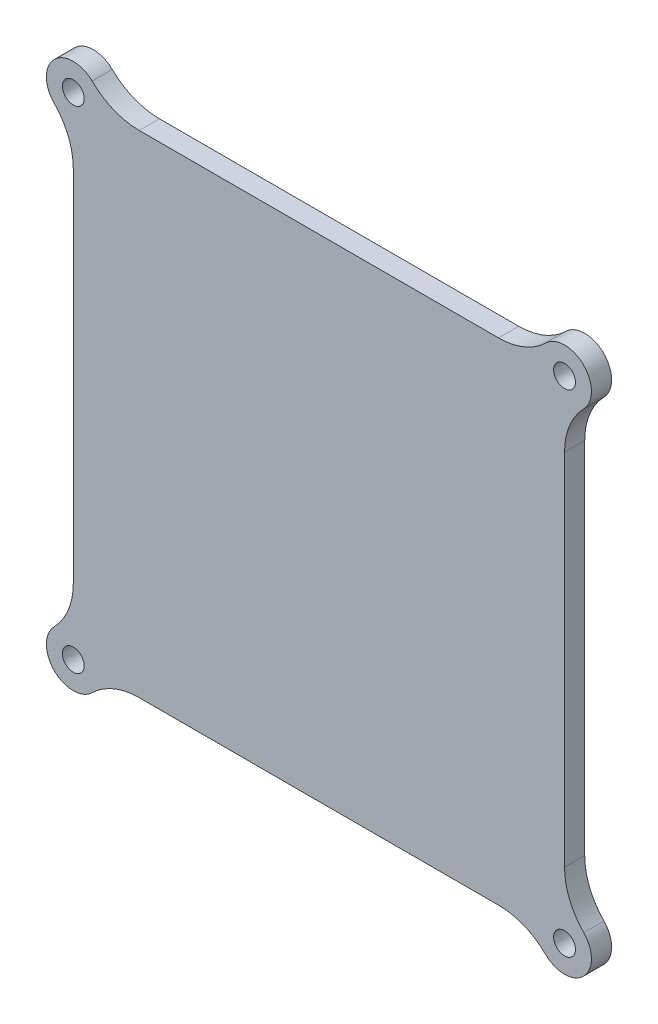
ISO-10303-21;
HEADER;
FILE_DESCRIPTION(('STEP AP214'),'2;1');
FILE_NAME('part.step','',(''),(''),'','','');
FILE_SCHEMA(('AUTOMOTIVE_DESIGN { 1 0 10303 214 1 1 1 1 }'));
ENDSEC;
DATA;
#1=APPLICATION_CONTEXT('core data for automotive mechanical design processes');
#2=APPLICATION_PROTOCOL_DEFINITION('international standard','automotive_design',2000,#1);
#3=PRODUCT_CONTEXT('',#1,'mechanical');
#4=PRODUCT('Part','Part','',(#3));
#5=PRODUCT_RELATED_PRODUCT_CATEGORY('part','',(#4));
#6=PRODUCT_DEFINITION_FORMATION('','',#4);
#7=PRODUCT_DEFINITION_CONTEXT('part definition',#1,'design');
#8=PRODUCT_DEFINITION('design','',#6,#7);
#9=PRODUCT_DEFINITION_SHAPE('','',#8);
#10=(LENGTH_UNIT() NAMED_UNIT(*) SI_UNIT(.MILLI.,.METRE.));
#11=(NAMED_UNIT(*) PLANE_ANGLE_UNIT() SI_UNIT($,.RADIAN.));
#12=(NAMED_UNIT(*) SI_UNIT($,.STERADIAN.) SOLID_ANGLE_UNIT());
#13=UNCERTAINTY_MEASURE_WITH_UNIT(LENGTH_MEASURE(1.E-05),#10,'distance_accuracy_value','');
#14=(GEOMETRIC_REPRESENTATION_CONTEXT(3) GLOBAL_UNCERTAINTY_ASSIGNED_CONTEXT((#13)) GLOBAL_UNIT_ASSIGNED_CONTEXT((#10,
#11,#12)) REPRESENTATION_CONTEXT('',''));
#15=CARTESIAN_POINT('',(0.,0.,0.));
#16=DIRECTION('',(0.,0.,1.));
#17=DIRECTION('',(1.,0.,0.));
#18=AXIS2_PLACEMENT_3D('',#15,#16,#17);
#19=CARTESIAN_POINT('',(-36.5160555535694,-36.5160555535694,3.));
#20=DIRECTION('',(0.,0.,-1.));
#21=DIRECTION('',(-1.,0.,0.));
#22=AXIS2_PLACEMENT_3D('',#19,#20,#21);
#23=CYLINDRICAL_SURFACE('',#22,4.);
#24=CARTESIAN_POINT('',(-36.5160555535694,-36.5160555535694,0.));
#25=DIRECTION('',(0.,0.,1.));
#26=DIRECTION('',(1.,0.,0.));
#27=AXIS2_PLACEMENT_3D('',#24,#25,#26);
#28=CIRCLE('',#27,4.);
#29=CARTESIAN_POINT('',(-39.3731984107122,-33.7166387046743,0.));
#30=VERTEX_POINT('',#29);
#31=CARTESIAN_POINT('',(-33.7166387046743,-39.3731984107122,0.));
#32=VERTEX_POINT('',#31);
#33=EDGE_CURVE('E174',#30,#32,#28,.T.);
#34=ORIENTED_EDGE('',*,*,#33,.T.);
#35=DIRECTION('',(0.,0.,-1.));
#36=VECTOR('',#35,1.);
#37=CARTESIAN_POINT('',(-33.7166387046743,-39.3731984107122,3.));
#38=LINE('',#37,#36);
#39=CARTESIAN_POINT('',(-33.7166387046743,-39.3731984107122,3.));
#40=VERTEX_POINT('',#39);
#41=EDGE_CURVE('E153',#32,#40,#38,.F.);
#42=ORIENTED_EDGE('',*,*,#41,.T.);
#43=CARTESIAN_POINT('',(-36.5160555535694,-36.5160555535694,3.));
#44=DIRECTION('',(0.,0.,1.));
#45=DIRECTION('',(1.,0.,0.));
#46=AXIS2_PLACEMENT_3D('',#43,#44,#45);
#47=CIRCLE('',#46,4.);
#48=CARTESIAN_POINT('',(-39.3731984107122,-33.7166387046743,3.));
#49=VERTEX_POINT('',#48);
#50=EDGE_CURVE('E207',#49,#40,#47,.T.);
#51=ORIENTED_EDGE('',*,*,#50,.F.);
#52=DIRECTION('',(0.,0.,-1.));
#53=VECTOR('',#52,1.);
#54=CARTESIAN_POINT('',(-39.3731984107122,-33.7166387046743,3.));
#55=LINE('',#54,#53);
#56=EDGE_CURVE('E167',#49,#30,#55,.T.);
#57=ORIENTED_EDGE('',*,*,#56,.T.);
#58=EDGE_LOOP('',(#34,#42,#51,#57));
#59=FACE_BOUND('',#58,.T.);
#60=ADVANCED_FACE('F35',(#59),#23,.T.);
#61=CARTESIAN_POINT('',(0.,-36.5160555535694,3.));
#62=DIRECTION('',(0.,1.,0.));
#63=DIRECTION('',(0.,0.,1.));
#64=AXIS2_PLACEMENT_3D('',#61,#62,#63);
#65=PLANE('',#64);
#66=DIRECTION('',(1.,0.,0.));
#67=VECTOR('',#66,1.);
#68=CARTESIAN_POINT('',(0.,-36.5160555535694,3.));
#69=LINE('',#68,#67);
#70=CARTESIAN_POINT('',(-26.7180965824366,-36.5160555535694,3.));
#71=VERTEX_POINT('',#70);
#72=CARTESIAN_POINT('',(26.7180965824361,-36.5160555535694,3.));
#73=VERTEX_POINT('',#72);
#74=EDGE_CURVE('E166',#71,#73,#69,.T.);
#75=ORIENTED_EDGE('',*,*,#74,.F.);
#76=DIRECTION('',(0.,0.,1.));
#77=VECTOR('',#76,1.);
#78=CARTESIAN_POINT('',(-26.7180965824366,-36.5160555535694,0.));
#79=LINE('',#78,#77);
#80=CARTESIAN_POINT('',(-26.7180965824366,-36.5160555535694,0.));
#81=VERTEX_POINT('',#80);
#82=EDGE_CURVE('E152',#71,#81,#79,.F.);
#83=ORIENTED_EDGE('',*,*,#82,.T.);
#84=DIRECTION('',(1.,0.,0.));
#85=VECTOR('',#84,1.);
#86=CARTESIAN_POINT('',(0.,-36.5160555535694,0.));
#87=LINE('',#86,#85);
#88=CARTESIAN_POINT('',(26.7180965824361,-36.5160555535694,0.));
#89=VERTEX_POINT('',#88);
#90=EDGE_CURVE('E164',#81,#89,#87,.T.);
#91=ORIENTED_EDGE('',*,*,#90,.T.);
#92=DIRECTION('',(0.,0.,1.));
#93=VECTOR('',#92,1.);
#94=CARTESIAN_POINT('',(26.7180965824361,-36.5160555535694,3.));
#95=LINE('',#94,#93);
#96=EDGE_CURVE('E168',#89,#73,#95,.T.);
#97=ORIENTED_EDGE('',*,*,#96,.T.);
#98=EDGE_LOOP('',(#75,#83,#91,#97));
#99=FACE_BOUND('',#98,.T.);
#100=ADVANCED_FACE('F163',(#99),#65,.F.);
#101=CARTESIAN_POINT('',(36.5160555535691,-36.5160555535696,3.));
#102=DIRECTION('',(0.,0.,-1.));
#103=DIRECTION('',(-1.,0.,0.));
#104=AXIS2_PLACEMENT_3D('',#101,#102,#103);
#105=CYLINDRICAL_SURFACE('',#104,4.);
#106=CARTESIAN_POINT('',(36.5160555535691,-36.5160555535696,0.));
#107=DIRECTION('',(0.,0.,1.));
#108=DIRECTION('',(1.,0.,0.));
#109=AXIS2_PLACEMENT_3D('',#106,#107,#108);
#110=CIRCLE('',#109,4.);
#111=CARTESIAN_POINT('',(33.716638704674,-39.3731984107124,0.));
#112=VERTEX_POINT('',#111);
#113=CARTESIAN_POINT('',(39.373198410712,-33.7166387046747,0.));
#114=VERTEX_POINT('',#113);
#115=EDGE_CURVE('E173',#112,#114,#110,.T.);
#116=ORIENTED_EDGE('',*,*,#115,.T.);
#117=DIRECTION('',(0.,0.,-1.));
#118=VECTOR('',#117,1.);
#119=CARTESIAN_POINT('',(39.373198410712,-33.7166387046747,3.));
#120=LINE('',#119,#118);
#121=CARTESIAN_POINT('',(39.373198410712,-33.7166387046747,3.));
#122=VERTEX_POINT('',#121);
#123=EDGE_CURVE('E50',#114,#122,#120,.F.);
#124=ORIENTED_EDGE('',*,*,#123,.T.);
#125=CARTESIAN_POINT('',(36.5160555535691,-36.5160555535696,3.));
#126=DIRECTION('',(0.,0.,1.));
#127=DIRECTION('',(1.,0.,0.));
#128=AXIS2_PLACEMENT_3D('',#125,#126,#127);
#129=CIRCLE('',#128,4.);
#130=CARTESIAN_POINT('',(33.716638704674,-39.3731984107124,3.));
#131=VERTEX_POINT('',#130);
#132=EDGE_CURVE('E274',#131,#122,#129,.T.);
#133=ORIENTED_EDGE('',*,*,#132,.F.);
#134=DIRECTION('',(0.,0.,-1.));
#135=VECTOR('',#134,1.);
#136=CARTESIAN_POINT('',(33.716638704674,-39.3731984107124,3.));
#137=LINE('',#136,#135);
#138=EDGE_CURVE('E238',#131,#112,#137,.T.);
#139=ORIENTED_EDGE('',*,*,#138,.T.);
#140=EDGE_LOOP('',(#116,#124,#133,#139));
#141=FACE_BOUND('',#140,.T.);
#142=ADVANCED_FACE('F284',(#141),#105,.T.);
#143=CARTESIAN_POINT('',(36.5160555535694,0.,3.));
#144=DIRECTION('',(-1.,0.,0.));
#145=DIRECTION('',(0.,-1.,0.));
#146=AXIS2_PLACEMENT_3D('',#143,#144,#145);
#147=PLANE('',#146);
#148=DIRECTION('',(0.,1.,0.));
#149=VECTOR('',#148,1.);
#150=CARTESIAN_POINT('',(36.5160555535694,0.,0.));
#151=LINE('',#150,#149);
#152=CARTESIAN_POINT('',(36.5160555535694,-26.7180965824372,0.));
#153=VERTEX_POINT('',#152);
#154=CARTESIAN_POINT('',(36.5160555535695,26.7180965824365,0.));
#155=VERTEX_POINT('',#154);
#156=EDGE_CURVE('E176',#153,#155,#151,.T.);
#157=ORIENTED_EDGE('',*,*,#156,.T.);
#158=DIRECTION('',(0.,0.,1.));
#159=VECTOR('',#158,1.);
#160=CARTESIAN_POINT('',(36.5160555535695,26.7180965824365,3.));
#161=LINE('',#160,#159);
#162=CARTESIAN_POINT('',(36.5160555535695,26.7180965824365,3.));
#163=VERTEX_POINT('',#162);
#164=EDGE_CURVE('E236',#155,#163,#161,.T.);
#165=ORIENTED_EDGE('',*,*,#164,.T.);
#166=DIRECTION('',(0.,1.,0.));
#167=VECTOR('',#166,1.);
#168=CARTESIAN_POINT('',(36.5160555535694,0.,3.));
#169=LINE('',#168,#167);
#170=CARTESIAN_POINT('',(36.5160555535694,-26.7180965824372,3.));
#171=VERTEX_POINT('',#170);
#172=EDGE_CURVE('E272',#171,#163,#169,.T.);
#173=ORIENTED_EDGE('',*,*,#172,.F.);
#174=DIRECTION('',(0.,0.,1.));
#175=VECTOR('',#174,1.);
#176=CARTESIAN_POINT('',(36.5160555535694,-26.7180965824372,0.));
#177=LINE('',#176,#175);
#178=EDGE_CURVE('E233',#171,#153,#177,.F.);
#179=ORIENTED_EDGE('',*,*,#178,.T.);
#180=EDGE_LOOP('',(#157,#165,#173,#179));
#181=FACE_BOUND('',#180,.T.);
#182=ADVANCED_FACE('F278',(#181),#147,.F.);
#183=CARTESIAN_POINT('',(36.5160555535695,36.5160555535692,3.));
#184=DIRECTION('',(0.,0.,-1.));
#185=DIRECTION('',(-1.,0.,0.));
#186=AXIS2_PLACEMENT_3D('',#183,#184,#185);
#187=CYLINDRICAL_SURFACE('',#186,4.);
#188=CARTESIAN_POINT('',(36.5160555535695,36.5160555535692,0.));
#189=DIRECTION('',(0.,0.,1.));
#190=DIRECTION('',(1.,0.,0.));
#191=AXIS2_PLACEMENT_3D('',#188,#189,#190);
#192=CIRCLE('',#191,4.);
#193=CARTESIAN_POINT('',(39.3731984107123,33.7166387046742,0.));
#194=VERTEX_POINT('',#193);
#195=CARTESIAN_POINT('',(33.7166387046744,39.3731984107121,0.));
#196=VERTEX_POINT('',#195);
#197=EDGE_CURVE('E183',#194,#196,#192,.T.);
#198=ORIENTED_EDGE('',*,*,#197,.T.);
#199=DIRECTION('',(0.,0.,-1.));
#200=VECTOR('',#199,1.);
#201=CARTESIAN_POINT('',(33.7166387046744,39.3731984107121,3.));
#202=LINE('',#201,#200);
#203=CARTESIAN_POINT('',(33.7166387046744,39.3731984107121,3.));
#204=VERTEX_POINT('',#203);
#205=EDGE_CURVE('E231',#196,#204,#202,.F.);
#206=ORIENTED_EDGE('',*,*,#205,.T.);
#207=CARTESIAN_POINT('',(36.5160555535695,36.5160555535692,3.));
#208=DIRECTION('',(0.,0.,1.));
#209=DIRECTION('',(1.,0.,0.));
#210=AXIS2_PLACEMENT_3D('',#207,#208,#209);
#211=CIRCLE('',#210,4.);
#212=CARTESIAN_POINT('',(39.3731984107123,33.7166387046742,3.));
#213=VERTEX_POINT('',#212);
#214=EDGE_CURVE('E281',#213,#204,#211,.T.);
#215=ORIENTED_EDGE('',*,*,#214,.F.);
#216=DIRECTION('',(0.,0.,-1.));
#217=VECTOR('',#216,1.);
#218=CARTESIAN_POINT('',(39.3731984107123,33.7166387046742,3.));
#219=LINE('',#218,#217);
#220=EDGE_CURVE('E228',#213,#194,#219,.T.);
#221=ORIENTED_EDGE('',*,*,#220,.T.);
#222=EDGE_LOOP('',(#198,#206,#215,#221));
#223=FACE_BOUND('',#222,.T.);
#224=ADVANCED_FACE('F451',(#223),#187,.T.);
#225=CARTESIAN_POINT('',(0.,36.5160555535693,3.));
#226=DIRECTION('',(0.,1.,0.));
#227=DIRECTION('',(-1.,0.,0.));
#228=AXIS2_PLACEMENT_3D('',#225,#226,#227);
#229=PLANE('',#228);
#230=DIRECTION('',(1.,0.,0.));
#231=VECTOR('',#230,1.);
#232=CARTESIAN_POINT('',(0.,36.5160555535693,0.));
#233=LINE('',#232,#231);
#234=CARTESIAN_POINT('',(-26.7180965824367,36.5160555535694,0.));
#235=VERTEX_POINT('',#234);
#236=CARTESIAN_POINT('',(26.7180965824368,36.5160555535693,0.));
#237=VERTEX_POINT('',#236);
#238=EDGE_CURVE('E186',#235,#237,#233,.T.);
#239=ORIENTED_EDGE('',*,*,#238,.F.);
#240=DIRECTION('',(0.,0.,-1.));
#241=VECTOR('',#240,1.);
#242=CARTESIAN_POINT('',(-26.7180965824367,36.5160555535694,3.));
#243=LINE('',#242,#241);
#244=CARTESIAN_POINT('',(-26.7180965824367,36.5160555535694,3.));
#245=VERTEX_POINT('',#244);
#246=EDGE_CURVE('E226',#235,#245,#243,.F.);
#247=ORIENTED_EDGE('',*,*,#246,.T.);
#248=DIRECTION('',(1.,0.,0.));
#249=VECTOR('',#248,1.);
#250=CARTESIAN_POINT('',(0.,36.5160555535693,3.));
#251=LINE('',#250,#249);
#252=CARTESIAN_POINT('',(26.7180965824368,36.5160555535693,3.));
#253=VERTEX_POINT('',#252);
#254=EDGE_CURVE('E294',#245,#253,#251,.T.);
#255=ORIENTED_EDGE('',*,*,#254,.T.);
#256=DIRECTION('',(0.,0.,-1.));
#257=VECTOR('',#256,1.);
#258=CARTESIAN_POINT('',(26.7180965824368,36.5160555535693,3.));
#259=LINE('',#258,#257);
#260=EDGE_CURVE('E223',#253,#237,#259,.T.);
#261=ORIENTED_EDGE('',*,*,#260,.T.);
#262=EDGE_LOOP('',(#239,#247,#255,#261));
#263=FACE_BOUND('',#262,.T.);
#264=ADVANCED_FACE('F439',(#263),#229,.T.);
#265=CARTESIAN_POINT('',(-36.5160555535694,36.5160555535694,3.));
#266=DIRECTION('',(0.,0.,-1.));
#267=DIRECTION('',(-1.,0.,0.));
#268=AXIS2_PLACEMENT_3D('',#265,#266,#267);
#269=CYLINDRICAL_SURFACE('',#268,4.);
#270=CARTESIAN_POINT('',(-36.5160555535694,36.5160555535694,3.));
#271=DIRECTION('',(0.,0.,1.));
#272=DIRECTION('',(1.,0.,0.));
#273=AXIS2_PLACEMENT_3D('',#270,#271,#272);
#274=CIRCLE('',#273,4.);
#275=CARTESIAN_POINT('',(-33.7166387046743,39.3731984107122,3.));
#276=VERTEX_POINT('',#275);
#277=CARTESIAN_POINT('',(-39.3731984107122,33.7166387046743,3.));
#278=VERTEX_POINT('',#277);
#279=EDGE_CURVE('E297',#276,#278,#274,.T.);
#280=ORIENTED_EDGE('',*,*,#279,.F.);
#281=DIRECTION('',(0.,0.,-1.));
#282=VECTOR('',#281,1.);
#283=CARTESIAN_POINT('',(-33.7166387046743,39.3731984107122,3.));
#284=LINE('',#283,#282);
#285=CARTESIAN_POINT('',(-33.7166387046743,39.3731984107122,0.));
#286=VERTEX_POINT('',#285);
#287=EDGE_CURVE('E220',#276,#286,#284,.T.);
#288=ORIENTED_EDGE('',*,*,#287,.T.);
#289=CARTESIAN_POINT('',(-36.5160555535694,36.5160555535694,0.));
#290=DIRECTION('',(0.,0.,1.));
#291=DIRECTION('',(1.,0.,0.));
#292=AXIS2_PLACEMENT_3D('',#289,#290,#291);
#293=CIRCLE('',#292,4.);
#294=CARTESIAN_POINT('',(-39.3731984107122,33.7166387046743,0.));
#295=VERTEX_POINT('',#294);
#296=EDGE_CURVE('E189',#286,#295,#293,.T.);
#297=ORIENTED_EDGE('',*,*,#296,.T.);
#298=DIRECTION('',(0.,0.,-1.));
#299=VECTOR('',#298,1.);
#300=CARTESIAN_POINT('',(-39.3731984107122,33.7166387046743,3.));
#301=LINE('',#300,#299);
#302=EDGE_CURVE('E218',#295,#278,#301,.F.);
#303=ORIENTED_EDGE('',*,*,#302,.T.);
#304=EDGE_LOOP('',(#280,#288,#297,#303));
#305=FACE_BOUND('',#304,.T.);
#306=ADVANCED_FACE('F433',(#305),#269,.T.);
#307=CARTESIAN_POINT('',(-36.5160555535694,-36.5160555535694,3.));
#308=DIRECTION('',(0.,0.,-1.));
#309=DIRECTION('',(-1.,0.,0.));
#310=AXIS2_PLACEMENT_3D('',#307,#308,#309);
#311=CYLINDRICAL_SURFACE('',#310,1.6250000000005);
#312=CARTESIAN_POINT('',(-36.5160555535694,-36.5160555535694,3.));
#313=DIRECTION('',(0.,0.,1.));
#314=DIRECTION('',(1.,0.,0.));
#315=AXIS2_PLACEMENT_3D('',#312,#313,#314);
#316=CIRCLE('',#315,1.6250000000005);
#317=CARTESIAN_POINT('',(-34.8910555535689,-36.5160555535694,3.));
#318=VERTEX_POINT('',#317);
#319=EDGE_CURVE('E309',#318,#318,#316,.T.);
#320=ORIENTED_EDGE('',*,*,#319,.T.);
#321=EDGE_LOOP('',(#320));
#322=FACE_BOUND('',#321,.T.);
#323=CARTESIAN_POINT('',(-36.5160555535694,-36.5160555535694,0.));
#324=DIRECTION('',(0.,0.,1.));
#325=DIRECTION('',(1.,0.,0.));
#326=AXIS2_PLACEMENT_3D('',#323,#324,#325);
#327=CIRCLE('',#326,1.6250000000005);
#328=CARTESIAN_POINT('',(-34.8910555535689,-36.5160555535694,0.));
#329=VERTEX_POINT('',#328);
#330=EDGE_CURVE('E201',#329,#329,#327,.T.);
#331=ORIENTED_EDGE('',*,*,#330,.F.);
#332=EDGE_LOOP('',(#331));
#333=FACE_BOUND('',#332,.T.);
#334=ADVANCED_FACE('F438',(#322,#333),#311,.F.);
#335=CARTESIAN_POINT('',(36.5160555535695,36.5160555535692,3.));
#336=DIRECTION('',(0.,0.,-1.));
#337=DIRECTION('',(-1.,0.,0.));
#338=AXIS2_PLACEMENT_3D('',#335,#336,#337);
#339=CYLINDRICAL_SURFACE('',#338,1.62500000000001);
#340=CARTESIAN_POINT('',(36.5160555535695,36.5160555535692,3.));
#341=DIRECTION('',(0.,0.,1.));
#342=DIRECTION('',(1.,0.,0.));
#343=AXIS2_PLACEMENT_3D('',#340,#341,#342);
#344=CIRCLE('',#343,1.62500000000001);
#345=CARTESIAN_POINT('',(38.1410555535695,36.5160555535692,3.));
#346=VERTEX_POINT('',#345);
#347=EDGE_CURVE('E306',#346,#346,#344,.T.);
#348=ORIENTED_EDGE('',*,*,#347,.T.);
#349=EDGE_LOOP('',(#348));
#350=FACE_BOUND('',#349,.T.);
#351=CARTESIAN_POINT('',(36.5160555535695,36.5160555535692,0.));
#352=DIRECTION('',(0.,0.,1.));
#353=DIRECTION('',(1.,0.,0.));
#354=AXIS2_PLACEMENT_3D('',#351,#352,#353);
#355=CIRCLE('',#354,1.62500000000001);
#356=CARTESIAN_POINT('',(38.1410555535695,36.5160555535692,0.));
#357=VERTEX_POINT('',#356);
#358=EDGE_CURVE('E198',#357,#357,#355,.T.);
#359=ORIENTED_EDGE('',*,*,#358,.F.);
#360=EDGE_LOOP('',(#359));
#361=FACE_BOUND('',#360,.T.);
#362=ADVANCED_FACE('F499',(#350,#361),#339,.F.);
#363=CARTESIAN_POINT('',(36.5160555535691,-36.5160555535696,3.));
#364=DIRECTION('',(0.,0.,-1.));
#365=DIRECTION('',(-1.,0.,0.));
#366=AXIS2_PLACEMENT_3D('',#363,#364,#365);
#367=CYLINDRICAL_SURFACE('',#366,1.625);
#368=CARTESIAN_POINT('',(36.5160555535691,-36.5160555535696,3.));
#369=DIRECTION('',(0.,0.,1.));
#370=DIRECTION('',(1.,0.,0.));
#371=AXIS2_PLACEMENT_3D('',#368,#369,#370);
#372=CIRCLE('',#371,1.625);
#373=CARTESIAN_POINT('',(38.1410555535691,-36.5160555535696,3.));
#374=VERTEX_POINT('',#373);
#375=EDGE_CURVE('E303',#374,#374,#372,.T.);
#376=ORIENTED_EDGE('',*,*,#375,.T.);
#377=EDGE_LOOP('',(#376));
#378=FACE_BOUND('',#377,.T.);
#379=CARTESIAN_POINT('',(36.5160555535691,-36.5160555535696,0.));
#380=DIRECTION('',(0.,0.,1.));
#381=DIRECTION('',(1.,0.,0.));
#382=AXIS2_PLACEMENT_3D('',#379,#380,#381);
#383=CIRCLE('',#382,1.625);
#384=CARTESIAN_POINT('',(38.1410555535691,-36.5160555535696,0.));
#385=VERTEX_POINT('',#384);
#386=EDGE_CURVE('E195',#385,#385,#383,.T.);
#387=ORIENTED_EDGE('',*,*,#386,.F.);
#388=EDGE_LOOP('',(#387));
#389=FACE_BOUND('',#388,.T.);
#390=ADVANCED_FACE('F424',(#378,#389),#367,.F.);
#391=CARTESIAN_POINT('',(-36.5160555535694,0.,3.));
#392=DIRECTION('',(-1.,0.,0.));
#393=DIRECTION('',(0.,0.,1.));
#394=AXIS2_PLACEMENT_3D('',#391,#392,#393);
#395=PLANE('',#394);
#396=DIRECTION('',(0.,1.,0.));
#397=VECTOR('',#396,1.);
#398=CARTESIAN_POINT('',(-36.5160555535694,0.,0.));
#399=LINE('',#398,#397);
#400=CARTESIAN_POINT('',(-36.5160555535694,-26.7180965824367,0.));
#401=VERTEX_POINT('',#400);
#402=CARTESIAN_POINT('',(-36.5160555535694,26.7180965824366,0.));
#403=VERTEX_POINT('',#402);
#404=EDGE_CURVE('E192',#401,#403,#399,.T.);
#405=ORIENTED_EDGE('',*,*,#404,.F.);
#406=DIRECTION('',(0.,0.,-1.));
#407=VECTOR('',#406,1.);
#408=CARTESIAN_POINT('',(-36.5160555535694,-26.7180965824367,3.));
#409=LINE('',#408,#407);
#410=CARTESIAN_POINT('',(-36.5160555535694,-26.7180965824367,3.));
#411=VERTEX_POINT('',#410);
#412=EDGE_CURVE('E216',#401,#411,#409,.F.);
#413=ORIENTED_EDGE('',*,*,#412,.T.);
#414=DIRECTION('',(0.,1.,0.));
#415=VECTOR('',#414,1.);
#416=CARTESIAN_POINT('',(-36.5160555535694,0.,3.));
#417=LINE('',#416,#415);
#418=CARTESIAN_POINT('',(-36.5160555535694,26.7180965824366,3.));
#419=VERTEX_POINT('',#418);
#420=EDGE_CURVE('E300',#411,#419,#417,.T.);
#421=ORIENTED_EDGE('',*,*,#420,.T.);
#422=DIRECTION('',(0.,0.,-1.));
#423=VECTOR('',#422,1.);
#424=CARTESIAN_POINT('',(-36.5160555535694,26.7180965824366,3.));
#425=LINE('',#424,#423);
#426=EDGE_CURVE('E213',#419,#403,#425,.T.);
#427=ORIENTED_EDGE('',*,*,#426,.T.);
#428=EDGE_LOOP('',(#405,#413,#421,#427));
#429=FACE_BOUND('',#428,.T.);
#430=ADVANCED_FACE('F324',(#429),#395,.T.);
#431=CARTESIAN_POINT('',(-36.5160555535694,36.5160555535694,3.));
#432=DIRECTION('',(0.,0.,-1.));
#433=DIRECTION('',(-1.,0.,0.));
#434=AXIS2_PLACEMENT_3D('',#431,#432,#433);
#435=CYLINDRICAL_SURFACE('',#434,1.625);
#436=CARTESIAN_POINT('',(-36.5160555535694,36.5160555535694,3.));
#437=DIRECTION('',(0.,0.,1.));
#438=DIRECTION('',(1.,0.,0.));
#439=AXIS2_PLACEMENT_3D('',#436,#437,#438);
#440=CIRCLE('',#439,1.625);
#441=CARTESIAN_POINT('',(-34.8910555535694,36.5160555535694,3.));
#442=VERTEX_POINT('',#441);
#443=EDGE_CURVE('E208',#442,#442,#440,.T.);
#444=ORIENTED_EDGE('',*,*,#443,.T.);
#445=EDGE_LOOP('',(#444));
#446=FACE_BOUND('',#445,.T.);
#447=CARTESIAN_POINT('',(-36.5160555535694,36.5160555535694,0.));
#448=DIRECTION('',(0.,0.,1.));
#449=DIRECTION('',(1.,0.,0.));
#450=AXIS2_PLACEMENT_3D('',#447,#448,#449);
#451=CIRCLE('',#450,1.625);
#452=CARTESIAN_POINT('',(-34.8910555535694,36.5160555535694,0.));
#453=VERTEX_POINT('',#452);
#454=EDGE_CURVE('E204',#453,#453,#451,.T.);
#455=ORIENTED_EDGE('',*,*,#454,.F.);
#456=EDGE_LOOP('',(#455));
#457=FACE_BOUND('',#456,.T.);
#458=ADVANCED_FACE('F314',(#446,#457),#435,.F.);
#459=CARTESIAN_POINT('',(0.,0.,3.));
#460=DIRECTION('',(0.,0.,1.));
#461=DIRECTION('',(1.,0.,0.));
#462=AXIS2_PLACEMENT_3D('',#459,#460,#461);
#463=PLANE('',#462);
#464=ORIENTED_EDGE('',*,*,#420,.F.);
#465=CARTESIAN_POINT('',(-46.5160555535694,-26.7180965824367,3.));
#466=DIRECTION('',(0.,0.,1.));
#467=DIRECTION('',(1.,0.,0.));
#468=AXIS2_PLACEMENT_3D('',#465,#466,#467);
#469=CIRCLE('',#468,10.);
#470=EDGE_CURVE('E245',#411,#49,#469,.F.);
#471=ORIENTED_EDGE('',*,*,#470,.T.);
#472=ORIENTED_EDGE('',*,*,#50,.T.);
#473=CARTESIAN_POINT('',(-26.7180965824366,-46.5160555535694,3.));
#474=DIRECTION('',(0.,0.,1.));
#475=DIRECTION('',(1.,0.,0.));
#476=AXIS2_PLACEMENT_3D('',#473,#474,#475);
#477=CIRCLE('',#476,10.);
#478=EDGE_CURVE('E158',#40,#71,#477,.F.);
#479=ORIENTED_EDGE('',*,*,#478,.T.);
#480=ORIENTED_EDGE('',*,*,#74,.T.);
#481=CARTESIAN_POINT('',(26.7180965824361,-46.5160555535694,3.));
#482=DIRECTION('',(0.,0.,1.));
#483=DIRECTION('',(1.,0.,0.));
#484=AXIS2_PLACEMENT_3D('',#481,#482,#483);
#485=CIRCLE('',#484,10.);
#486=EDGE_CURVE('E11',#73,#131,#485,.F.);
#487=ORIENTED_EDGE('',*,*,#486,.T.);
#488=ORIENTED_EDGE('',*,*,#132,.T.);
#489=CARTESIAN_POINT('',(46.5160555535694,-26.7180965824372,3.));
#490=DIRECTION('',(0.,0.,1.));
#491=DIRECTION('',(1.,0.,0.));
#492=AXIS2_PLACEMENT_3D('',#489,#490,#491);
#493=CIRCLE('',#492,10.);
#494=EDGE_CURVE('E265',#122,#171,#493,.F.);
#495=ORIENTED_EDGE('',*,*,#494,.T.);
#496=ORIENTED_EDGE('',*,*,#172,.T.);
#497=CARTESIAN_POINT('',(46.5160555535695,26.7180965824365,3.));
#498=DIRECTION('',(0.,0.,1.));
#499=DIRECTION('',(1.,0.,0.));
#500=AXIS2_PLACEMENT_3D('',#497,#498,#499);
#501=CIRCLE('',#500,10.);
#502=EDGE_CURVE('E261',#163,#213,#501,.F.);
#503=ORIENTED_EDGE('',*,*,#502,.T.);
#504=ORIENTED_EDGE('',*,*,#214,.T.);
#505=CARTESIAN_POINT('',(26.7180965824368,46.5160555535693,3.));
#506=DIRECTION('',(0.,0.,1.));
#507=DIRECTION('',(1.,0.,0.));
#508=AXIS2_PLACEMENT_3D('',#505,#506,#507);
#509=CIRCLE('',#508,10.);
#510=EDGE_CURVE('E257',#204,#253,#509,.F.);
#511=ORIENTED_EDGE('',*,*,#510,.T.);
#512=ORIENTED_EDGE('',*,*,#254,.F.);
#513=CARTESIAN_POINT('',(-26.7180965824366,46.5160555535694,3.));
#514=DIRECTION('',(0.,0.,1.));
#515=DIRECTION('',(1.,0.,0.));
#516=AXIS2_PLACEMENT_3D('',#513,#514,#515);
#517=CIRCLE('',#516,10.);
#518=EDGE_CURVE('E249',#245,#276,#517,.F.);
#519=ORIENTED_EDGE('',*,*,#518,.T.);
#520=ORIENTED_EDGE('',*,*,#279,.T.);
#521=CARTESIAN_POINT('',(-46.5160555535694,26.7180965824366,3.));
#522=DIRECTION('',(0.,0.,1.));
#523=DIRECTION('',(1.,0.,0.));
#524=AXIS2_PLACEMENT_3D('',#521,#522,#523);
#525=CIRCLE('',#524,10.);
#526=EDGE_CURVE('E253',#278,#419,#525,.F.);
#527=ORIENTED_EDGE('',*,*,#526,.T.);
#528=EDGE_LOOP('',(#464,#471,#472,#479,#480,#487,#488,#495,#496,#503,#504,#511,#512,#519,#520,#527));
#529=FACE_BOUND('',#528,.T.);
#530=ORIENTED_EDGE('',*,*,#375,.F.);
#531=EDGE_LOOP('',(#530));
#532=FACE_BOUND('',#531,.T.);
#533=ORIENTED_EDGE('',*,*,#347,.F.);
#534=EDGE_LOOP('',(#533));
#535=FACE_BOUND('',#534,.T.);
#536=ORIENTED_EDGE('',*,*,#319,.F.);
#537=EDGE_LOOP('',(#536));
#538=FACE_BOUND('',#537,.T.);
#539=ORIENTED_EDGE('',*,*,#443,.F.);
#540=EDGE_LOOP('',(#539));
#541=FACE_BOUND('',#540,.T.);
#542=ADVANCED_FACE('F270',(#529,#532,#535,#538,#541),#463,.T.);
#543=CARTESIAN_POINT('',(0.,0.,0.));
#544=DIRECTION('',(0.,0.,1.));
#545=DIRECTION('',(1.,0.,0.));
#546=AXIS2_PLACEMENT_3D('',#543,#544,#545);
#547=PLANE('',#546);
#548=ORIENTED_EDGE('',*,*,#33,.F.);
#549=CARTESIAN_POINT('',(-46.5160555535694,-26.7180965824367,0.));
#550=DIRECTION('',(0.,0.,1.));
#551=DIRECTION('',(1.,0.,0.));
#552=AXIS2_PLACEMENT_3D('',#549,#550,#551);
#553=CIRCLE('',#552,10.);
#554=EDGE_CURVE('E243',#30,#401,#553,.T.);
#555=ORIENTED_EDGE('',*,*,#554,.T.);
#556=ORIENTED_EDGE('',*,*,#404,.T.);
#557=CARTESIAN_POINT('',(-46.5160555535694,26.7180965824366,0.));
#558=DIRECTION('',(0.,0.,1.));
#559=DIRECTION('',(1.,0.,0.));
#560=AXIS2_PLACEMENT_3D('',#557,#558,#559);
#561=CIRCLE('',#560,10.);
#562=EDGE_CURVE('E251',#403,#295,#561,.T.);
#563=ORIENTED_EDGE('',*,*,#562,.T.);
#564=ORIENTED_EDGE('',*,*,#296,.F.);
#565=CARTESIAN_POINT('',(-26.7180965824366,46.5160555535694,0.));
#566=DIRECTION('',(0.,0.,1.));
#567=DIRECTION('',(1.,0.,0.));
#568=AXIS2_PLACEMENT_3D('',#565,#566,#567);
#569=CIRCLE('',#568,10.);
#570=EDGE_CURVE('E247',#286,#235,#569,.T.);
#571=ORIENTED_EDGE('',*,*,#570,.T.);
#572=ORIENTED_EDGE('',*,*,#238,.T.);
#573=CARTESIAN_POINT('',(26.7180965824368,46.5160555535693,0.));
#574=DIRECTION('',(0.,0.,1.));
#575=DIRECTION('',(1.,0.,0.));
#576=AXIS2_PLACEMENT_3D('',#573,#574,#575);
#577=CIRCLE('',#576,10.);
#578=EDGE_CURVE('E255',#237,#196,#577,.T.);
#579=ORIENTED_EDGE('',*,*,#578,.T.);
#580=ORIENTED_EDGE('',*,*,#197,.F.);
#581=CARTESIAN_POINT('',(46.5160555535695,26.7180965824365,0.));
#582=DIRECTION('',(0.,0.,1.));
#583=DIRECTION('',(1.,0.,0.));
#584=AXIS2_PLACEMENT_3D('',#581,#582,#583);
#585=CIRCLE('',#584,10.);
#586=EDGE_CURVE('E259',#194,#155,#585,.T.);
#587=ORIENTED_EDGE('',*,*,#586,.T.);
#588=ORIENTED_EDGE('',*,*,#156,.F.);
#589=CARTESIAN_POINT('',(46.5160555535694,-26.7180965824372,0.));
#590=DIRECTION('',(0.,0.,1.));
#591=DIRECTION('',(1.,0.,0.));
#592=AXIS2_PLACEMENT_3D('',#589,#590,#591);
#593=CIRCLE('',#592,10.);
#594=EDGE_CURVE('E263',#153,#114,#593,.T.);
#595=ORIENTED_EDGE('',*,*,#594,.T.);
#596=ORIENTED_EDGE('',*,*,#115,.F.);
#597=CARTESIAN_POINT('',(26.7180965824361,-46.5160555535694,0.));
#598=DIRECTION('',(0.,0.,1.));
#599=DIRECTION('',(1.,0.,0.));
#600=AXIS2_PLACEMENT_3D('',#597,#598,#599);
#601=CIRCLE('',#600,10.);
#602=EDGE_CURVE('E43',#112,#89,#601,.T.);
#603=ORIENTED_EDGE('',*,*,#602,.T.);
#604=ORIENTED_EDGE('',*,*,#90,.F.);
#605=CARTESIAN_POINT('',(-26.7180965824366,-46.5160555535694,0.));
#606=DIRECTION('',(0.,0.,1.));
#607=DIRECTION('',(1.,0.,0.));
#608=AXIS2_PLACEMENT_3D('',#605,#606,#607);
#609=CIRCLE('',#608,10.);
#610=EDGE_CURVE('E148',#81,#32,#609,.T.);
#611=ORIENTED_EDGE('',*,*,#610,.T.);
#612=EDGE_LOOP('',(#548,#555,#556,#563,#564,#571,#572,#579,#580,#587,#588,#595,#596,#603,#604,#611));
#613=FACE_BOUND('',#612,.T.);
#614=ORIENTED_EDGE('',*,*,#386,.T.);
#615=EDGE_LOOP('',(#614));
#616=FACE_BOUND('',#615,.T.);
#617=ORIENTED_EDGE('',*,*,#358,.T.);
#618=EDGE_LOOP('',(#617));
#619=FACE_BOUND('',#618,.T.);
#620=ORIENTED_EDGE('',*,*,#330,.T.);
#621=EDGE_LOOP('',(#620));
#622=FACE_BOUND('',#621,.T.);
#623=ORIENTED_EDGE('',*,*,#454,.T.);
#624=EDGE_LOOP('',(#623));
#625=FACE_BOUND('',#624,.T.);
#626=ADVANCED_FACE('F170',(#613,#616,#619,#622,#625),#547,.F.);
#627=CARTESIAN_POINT('',(-26.7180965824366,-46.5160555535694,3.));
#628=DIRECTION('',(0.,0.,-1.));
#629=DIRECTION('',(-1.,0.,0.));
#630=AXIS2_PLACEMENT_3D('',#627,#628,#629);
#631=CYLINDRICAL_SURFACE('',#630,10.);
#632=ORIENTED_EDGE('',*,*,#478,.F.);
#633=ORIENTED_EDGE('',*,*,#41,.F.);
#634=ORIENTED_EDGE('',*,*,#610,.F.);
#635=ORIENTED_EDGE('',*,*,#82,.F.);
#636=EDGE_LOOP('',(#632,#633,#634,#635));
#637=FACE_BOUND('',#636,.T.);
#638=ADVANCED_FACE('F151',(#637),#631,.F.);
#639=CARTESIAN_POINT('',(-46.5160555535694,-26.7180965824367,3.));
#640=DIRECTION('',(0.,0.,-1.));
#641=DIRECTION('',(-1.,0.,0.));
#642=AXIS2_PLACEMENT_3D('',#639,#640,#641);
#643=CYLINDRICAL_SURFACE('',#642,10.);
#644=ORIENTED_EDGE('',*,*,#470,.F.);
#645=ORIENTED_EDGE('',*,*,#412,.F.);
#646=ORIENTED_EDGE('',*,*,#554,.F.);
#647=ORIENTED_EDGE('',*,*,#56,.F.);
#648=EDGE_LOOP('',(#644,#645,#646,#647));
#649=FACE_BOUND('',#648,.T.);
#650=ADVANCED_FACE('F337',(#649),#643,.F.);
#651=CARTESIAN_POINT('',(-26.7180965824366,46.5160555535694,3.));
#652=DIRECTION('',(0.,0.,-1.));
#653=DIRECTION('',(-1.,0.,0.));
#654=AXIS2_PLACEMENT_3D('',#651,#652,#653);
#655=CYLINDRICAL_SURFACE('',#654,10.);
#656=ORIENTED_EDGE('',*,*,#518,.F.);
#657=ORIENTED_EDGE('',*,*,#246,.F.);
#658=ORIENTED_EDGE('',*,*,#570,.F.);
#659=ORIENTED_EDGE('',*,*,#287,.F.);
#660=EDGE_LOOP('',(#656,#657,#658,#659));
#661=FACE_BOUND('',#660,.T.);
#662=ADVANCED_FACE('F340',(#661),#655,.F.);
#663=CARTESIAN_POINT('',(-46.5160555535694,26.7180965824366,3.));
#664=DIRECTION('',(0.,0.,-1.));
#665=DIRECTION('',(-1.,0.,0.));
#666=AXIS2_PLACEMENT_3D('',#663,#664,#665);
#667=CYLINDRICAL_SURFACE('',#666,10.);
#668=ORIENTED_EDGE('',*,*,#526,.F.);
#669=ORIENTED_EDGE('',*,*,#302,.F.);
#670=ORIENTED_EDGE('',*,*,#562,.F.);
#671=ORIENTED_EDGE('',*,*,#426,.F.);
#672=EDGE_LOOP('',(#668,#669,#670,#671));
#673=FACE_BOUND('',#672,.T.);
#674=ADVANCED_FACE('F344',(#673),#667,.F.);
#675=CARTESIAN_POINT('',(26.7180965824368,46.5160555535693,3.));
#676=DIRECTION('',(0.,0.,-1.));
#677=DIRECTION('',(-1.,0.,0.));
#678=AXIS2_PLACEMENT_3D('',#675,#676,#677);
#679=CYLINDRICAL_SURFACE('',#678,10.);
#680=ORIENTED_EDGE('',*,*,#510,.F.);
#681=ORIENTED_EDGE('',*,*,#205,.F.);
#682=ORIENTED_EDGE('',*,*,#578,.F.);
#683=ORIENTED_EDGE('',*,*,#260,.F.);
#684=EDGE_LOOP('',(#680,#681,#682,#683));
#685=FACE_BOUND('',#684,.T.);
#686=ADVANCED_FACE('F348',(#685),#679,.F.);
#687=CARTESIAN_POINT('',(46.5160555535695,26.7180965824365,3.));
#688=DIRECTION('',(0.,0.,-1.));
#689=DIRECTION('',(-1.,0.,0.));
#690=AXIS2_PLACEMENT_3D('',#687,#688,#689);
#691=CYLINDRICAL_SURFACE('',#690,10.);
#692=ORIENTED_EDGE('',*,*,#502,.F.);
#693=ORIENTED_EDGE('',*,*,#164,.F.);
#694=ORIENTED_EDGE('',*,*,#586,.F.);
#695=ORIENTED_EDGE('',*,*,#220,.F.);
#696=EDGE_LOOP('',(#692,#693,#694,#695));
#697=FACE_BOUND('',#696,.T.);
#698=ADVANCED_FACE('F352',(#697),#691,.F.);
#699=CARTESIAN_POINT('',(46.5160555535694,-26.7180965824372,3.));
#700=DIRECTION('',(0.,0.,-1.));
#701=DIRECTION('',(-1.,0.,0.));
#702=AXIS2_PLACEMENT_3D('',#699,#700,#701);
#703=CYLINDRICAL_SURFACE('',#702,10.);
#704=ORIENTED_EDGE('',*,*,#494,.F.);
#705=ORIENTED_EDGE('',*,*,#123,.F.);
#706=ORIENTED_EDGE('',*,*,#594,.F.);
#707=ORIENTED_EDGE('',*,*,#178,.F.);
#708=EDGE_LOOP('',(#704,#705,#706,#707));
#709=FACE_BOUND('',#708,.T.);
#710=ADVANCED_FACE('F283',(#709),#703,.F.);
#711=CARTESIAN_POINT('',(26.7180965824361,-46.5160555535694,3.));
#712=DIRECTION('',(0.,0.,-1.));
#713=DIRECTION('',(-1.,0.,0.));
#714=AXIS2_PLACEMENT_3D('',#711,#712,#713);
#715=CYLINDRICAL_SURFACE('',#714,10.);
#716=ORIENTED_EDGE('',*,*,#486,.F.);
#717=ORIENTED_EDGE('',*,*,#96,.F.);
#718=ORIENTED_EDGE('',*,*,#602,.F.);
#719=ORIENTED_EDGE('',*,*,#138,.F.);
#720=EDGE_LOOP('',(#716,#717,#718,#719));
#721=FACE_BOUND('',#720,.T.);
#722=ADVANCED_FACE('F37',(#721),#715,.F.);
#723=CLOSED_SHELL('',(#60,#100,#142,#182,#224,#264,#306,#334,#362,#390,#430,#458,#542,#626,#638,
#650,#662,#674,#686,#698,#710,#722));
#724=MANIFOLD_SOLID_BREP('B2',#723);
#725=ADVANCED_BREP_SHAPE_REPRESENTATION('',(#18,#724),#14);
#726=SHAPE_DEFINITION_REPRESENTATION(#9,#725);
ENDSEC;
END-ISO-10303-21;
